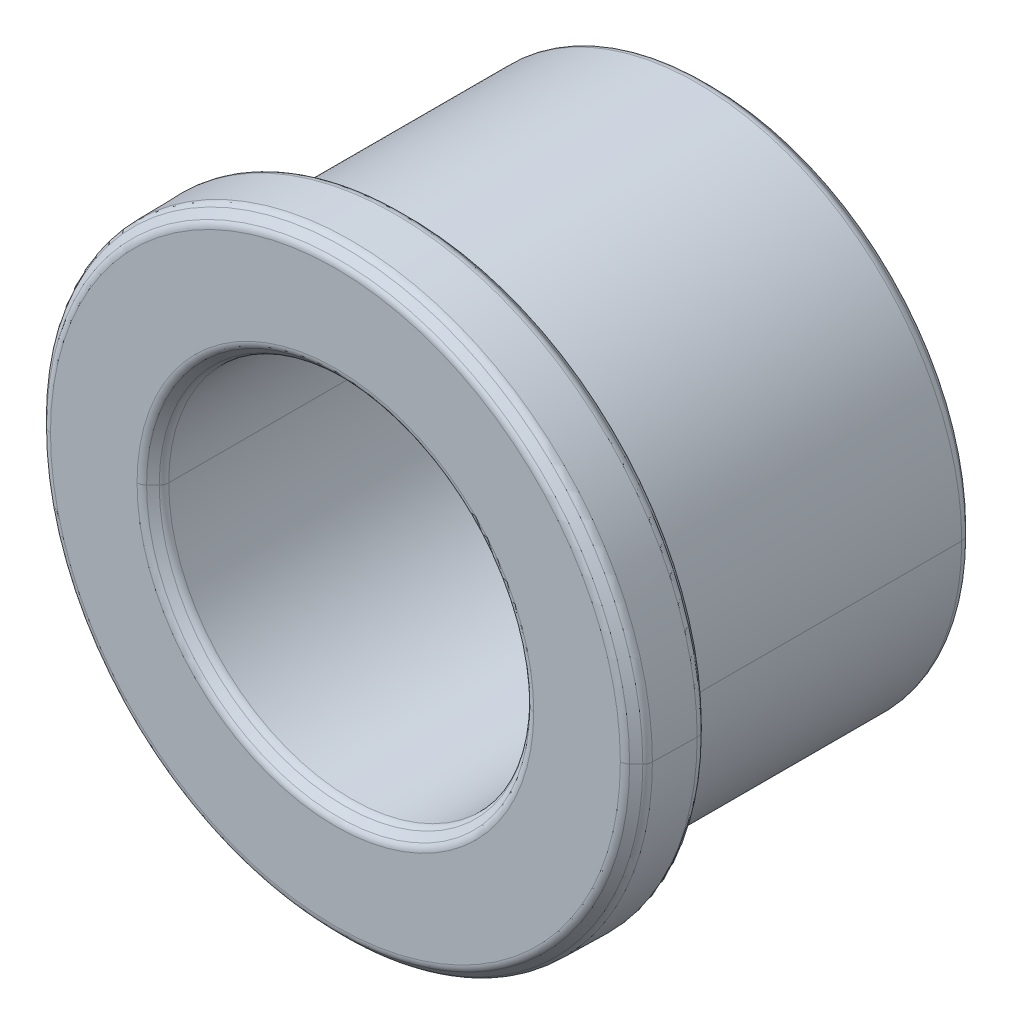
ISO-10303-21;
HEADER;
FILE_DESCRIPTION(('STEP AP214'),'2;1');
FILE_NAME('part.step','',(''),(''),'','','');
FILE_SCHEMA(('AUTOMOTIVE_DESIGN { 1 0 10303 214 1 1 1 1 }'));
ENDSEC;
DATA;
#1=APPLICATION_CONTEXT('core data for automotive mechanical design processes');
#2=APPLICATION_PROTOCOL_DEFINITION('international standard','automotive_design',2000,#1);
#3=PRODUCT_CONTEXT('',#1,'mechanical');
#4=PRODUCT('Part','Part','',(#3));
#5=PRODUCT_RELATED_PRODUCT_CATEGORY('part','',(#4));
#6=PRODUCT_DEFINITION_FORMATION('','',#4);
#7=PRODUCT_DEFINITION_CONTEXT('part definition',#1,'design');
#8=PRODUCT_DEFINITION('design','',#6,#7);
#9=PRODUCT_DEFINITION_SHAPE('','',#8);
#10=(LENGTH_UNIT() NAMED_UNIT(*) SI_UNIT(.MILLI.,.METRE.));
#11=(NAMED_UNIT(*) PLANE_ANGLE_UNIT() SI_UNIT($,.RADIAN.));
#12=(NAMED_UNIT(*) SI_UNIT($,.STERADIAN.) SOLID_ANGLE_UNIT());
#13=UNCERTAINTY_MEASURE_WITH_UNIT(LENGTH_MEASURE(1.E-05),#10,'distance_accuracy_value','');
#14=(GEOMETRIC_REPRESENTATION_CONTEXT(3) GLOBAL_UNCERTAINTY_ASSIGNED_CONTEXT((#13)) GLOBAL_UNIT_ASSIGNED_CONTEXT((#10,
#11,#12)) REPRESENTATION_CONTEXT('',''));
#15=CARTESIAN_POINT('',(0.,0.,0.));
#16=DIRECTION('',(0.,0.,1.));
#17=DIRECTION('',(1.,0.,0.));
#18=AXIS2_PLACEMENT_3D('',#15,#16,#17);
#19=CARTESIAN_POINT('',(0.,0.,3.76875));
#20=DIRECTION('',(0.,0.,-1.));
#21=DIRECTION('',(-1.,0.,0.));
#22=AXIS2_PLACEMENT_3D('',#19,#20,#21);
#23=TOROIDAL_SURFACE('',#22,5.98700479149173,0.2);
#24=CARTESIAN_POINT('',(5.98700479149173,0.,3.76875));
#25=DIRECTION('',(0.,1.,0.));
#26=DIRECTION('',(-1.,0.,0.));
#27=AXIS2_PLACEMENT_3D('',#24,#25,#26);
#28=CIRCLE('',#27,0.2);
#29=CARTESIAN_POINT('',(5.98700479149173,0.,3.96875));
#30=VERTEX_POINT('',#29);
#31=CARTESIAN_POINT('',(6.12593646558353,0.,3.91261796006773));
#32=VERTEX_POINT('',#31);
#33=EDGE_CURVE('E472',#30,#32,#28,.T.);
#34=ORIENTED_EDGE('',*,*,#33,.F.);
#35=CARTESIAN_POINT('',(0.,0.,3.96875));
#36=DIRECTION('',(0.,0.,1.));
#37=DIRECTION('',(-1.,0.,0.));
#38=AXIS2_PLACEMENT_3D('',#35,#36,#37);
#39=CIRCLE('',#38,5.98700479149173);
#40=CARTESIAN_POINT('',(-5.98700479149173,0.,3.96875));
#41=VERTEX_POINT('',#40);
#42=EDGE_CURVE('E334',#41,#30,#39,.T.);
#43=ORIENTED_EDGE('',*,*,#42,.F.);
#44=CARTESIAN_POINT('',(-5.98700479149173,0.,3.76875));
#45=DIRECTION('',(0.,-1.,0.));
#46=DIRECTION('',(0.,0.,-1.));
#47=AXIS2_PLACEMENT_3D('',#44,#45,#46);
#48=CIRCLE('',#47,0.2);
#49=CARTESIAN_POINT('',(-6.12593646558353,0.,3.91261796006773));
#50=VERTEX_POINT('',#49);
#51=EDGE_CURVE('E266',#41,#50,#48,.T.);
#52=ORIENTED_EDGE('',*,*,#51,.T.);
#53=CARTESIAN_POINT('',(0.,0.,3.91261796006773));
#54=DIRECTION('',(0.,0.,-1.));
#55=DIRECTION('',(-1.,0.,0.));
#56=AXIS2_PLACEMENT_3D('',#53,#54,#55);
#57=CIRCLE('',#56,6.12593646558353);
#58=EDGE_CURVE('E358',#32,#50,#57,.T.);
#59=ORIENTED_EDGE('',*,*,#58,.F.);
#60=EDGE_LOOP('',(#34,#43,#52,#59));
#61=FACE_BOUND('',#60,.T.);
#62=ADVANCED_FACE('F16',(#61),#23,.T.);
#63=CARTESIAN_POINT('',(0.,0.,3.76875));
#64=DIRECTION('',(0.,0.,-1.));
#65=DIRECTION('',(-1.,0.,0.));
#66=AXIS2_PLACEMENT_3D('',#63,#64,#65);
#67=TOROIDAL_SURFACE('',#66,4.16784271247462,0.2);
#68=CARTESIAN_POINT('',(4.16784271247462,0.,3.76875));
#69=DIRECTION('',(0.,1.,0.));
#70=DIRECTION('',(-1.,0.,0.));
#71=AXIS2_PLACEMENT_3D('',#68,#69,#70);
#72=CIRCLE('',#71,0.2);
#73=CARTESIAN_POINT('',(4.02642135623731,0.,3.91017135623731));
#74=VERTEX_POINT('',#73);
#75=CARTESIAN_POINT('',(4.16784271247462,0.,3.96875));
#76=VERTEX_POINT('',#75);
#77=EDGE_CURVE('E264',#74,#76,#72,.T.);
#78=ORIENTED_EDGE('',*,*,#77,.F.);
#79=CARTESIAN_POINT('',(0.,0.,3.91017135623731));
#80=DIRECTION('',(0.,0.,1.));
#81=DIRECTION('',(1.,0.,0.));
#82=AXIS2_PLACEMENT_3D('',#79,#80,#81);
#83=CIRCLE('',#82,4.02642135623731);
#84=CARTESIAN_POINT('',(-4.02642135623731,0.,3.91017135623731));
#85=VERTEX_POINT('',#84);
#86=EDGE_CURVE('E311',#85,#74,#83,.T.);
#87=ORIENTED_EDGE('',*,*,#86,.F.);
#88=CARTESIAN_POINT('',(-4.16784271247462,0.,3.76875));
#89=DIRECTION('',(0.,-1.,0.));
#90=DIRECTION('',(0.,0.,-1.));
#91=AXIS2_PLACEMENT_3D('',#88,#89,#90);
#92=CIRCLE('',#91,0.2);
#93=CARTESIAN_POINT('',(-4.16784271247462,0.,3.96875));
#94=VERTEX_POINT('',#93);
#95=EDGE_CURVE('E345',#85,#94,#92,.T.);
#96=ORIENTED_EDGE('',*,*,#95,.T.);
#97=CARTESIAN_POINT('',(0.,0.,3.96875));
#98=DIRECTION('',(0.,0.,-1.));
#99=DIRECTION('',(-1.,0.,0.));
#100=AXIS2_PLACEMENT_3D('',#97,#98,#99);
#101=CIRCLE('',#100,4.16784271247462);
#102=EDGE_CURVE('E300',#76,#94,#101,.T.);
#103=ORIENTED_EDGE('',*,*,#102,.F.);
#104=EDGE_LOOP('',(#78,#87,#96,#103));
#105=FACE_BOUND('',#104,.T.);
#106=ADVANCED_FACE('F18',(#105),#67,.T.);
#107=CARTESIAN_POINT('',(0.,0.,3.63590728752538));
#108=DIRECTION('',(0.,0.,-1.));
#109=DIRECTION('',(-1.,0.,0.));
#110=AXIS2_PLACEMENT_3D('',#107,#108,#109);
#111=TOROIDAL_SURFACE('',#110,4.035,0.2);
#112=CARTESIAN_POINT('',(4.035,0.,3.63590728752538));
#113=DIRECTION('',(0.,1.,0.));
#114=DIRECTION('',(-1.,0.,0.));
#115=AXIS2_PLACEMENT_3D('',#112,#113,#114);
#116=CIRCLE('',#115,0.2);
#117=CARTESIAN_POINT('',(3.835,0.,3.63590728752538));
#118=VERTEX_POINT('',#117);
#119=CARTESIAN_POINT('',(3.89357864376269,0.,3.77732864376269));
#120=VERTEX_POINT('',#119);
#121=EDGE_CURVE('E379',#118,#120,#116,.T.);
#122=ORIENTED_EDGE('',*,*,#121,.F.);
#123=CARTESIAN_POINT('',(0.,0.,3.63590728752538));
#124=DIRECTION('',(0.,0.,1.));
#125=DIRECTION('',(-1.,0.,0.));
#126=AXIS2_PLACEMENT_3D('',#123,#124,#125);
#127=CIRCLE('',#126,3.835);
#128=CARTESIAN_POINT('',(-3.835,0.,3.63590728752538));
#129=VERTEX_POINT('',#128);
#130=EDGE_CURVE('E331',#129,#118,#127,.T.);
#131=ORIENTED_EDGE('',*,*,#130,.F.);
#132=CARTESIAN_POINT('',(-4.035,0.,3.63590728752538));
#133=DIRECTION('',(0.,-1.,0.));
#134=DIRECTION('',(0.,0.,-1.));
#135=AXIS2_PLACEMENT_3D('',#132,#133,#134);
#136=CIRCLE('',#135,0.2);
#137=CARTESIAN_POINT('',(-3.89357864376269,0.,3.77732864376269));
#138=VERTEX_POINT('',#137);
#139=EDGE_CURVE('E258',#129,#138,#136,.T.);
#140=ORIENTED_EDGE('',*,*,#139,.T.);
#141=CARTESIAN_POINT('',(0.,0.,3.77732864376269));
#142=DIRECTION('',(0.,0.,-1.));
#143=DIRECTION('',(1.,0.,0.));
#144=AXIS2_PLACEMENT_3D('',#141,#142,#143);
#145=CIRCLE('',#144,3.89357864376269);
#146=EDGE_CURVE('E314',#120,#138,#145,.T.);
#147=ORIENTED_EDGE('',*,*,#146,.F.);
#148=EDGE_LOOP('',(#122,#131,#140,#147));
#149=FACE_BOUND('',#148,.T.);
#150=ADVANCED_FACE('F830',(#149),#111,.T.);
#151=CARTESIAN_POINT('',(0.,0.,-3.63590728752538));
#152=DIRECTION('',(0.,0.,1.));
#153=DIRECTION('',(1.,0.,0.));
#154=AXIS2_PLACEMENT_3D('',#151,#152,#153);
#155=TOROIDAL_SURFACE('',#154,4.035,0.2);
#156=CARTESIAN_POINT('',(-4.035,0.,-3.63590728752538));
#157=DIRECTION('',(0.,1.,0.));
#158=DIRECTION('',(-1.,0.,0.));
#159=AXIS2_PLACEMENT_3D('',#156,#157,#158);
#160=CIRCLE('',#159,0.2);
#161=CARTESIAN_POINT('',(-3.835,0.,-3.63590728752538));
#162=VERTEX_POINT('',#161);
#163=CARTESIAN_POINT('',(-3.89357864376269,0.,-3.77732864376269));
#164=VERTEX_POINT('',#163);
#165=EDGE_CURVE('E234',#162,#164,#160,.T.);
#166=ORIENTED_EDGE('',*,*,#165,.F.);
#167=CARTESIAN_POINT('',(0.,0.,-3.63590728752538));
#168=DIRECTION('',(0.,0.,-1.));
#169=DIRECTION('',(1.,0.,0.));
#170=AXIS2_PLACEMENT_3D('',#167,#168,#169);
#171=CIRCLE('',#170,3.835);
#172=CARTESIAN_POINT('',(3.835,0.,-3.63590728752538));
#173=VERTEX_POINT('',#172);
#174=EDGE_CURVE('E470',#173,#162,#171,.T.);
#175=ORIENTED_EDGE('',*,*,#174,.F.);
#176=CARTESIAN_POINT('',(4.035,0.,-3.63590728752538));
#177=DIRECTION('',(0.,-1.,0.));
#178=DIRECTION('',(0.,0.,-1.));
#179=AXIS2_PLACEMENT_3D('',#176,#177,#178);
#180=CIRCLE('',#179,0.2);
#181=CARTESIAN_POINT('',(3.89357864376269,0.,-3.77732864376269));
#182=VERTEX_POINT('',#181);
#183=EDGE_CURVE('E231',#173,#182,#180,.T.);
#184=ORIENTED_EDGE('',*,*,#183,.T.);
#185=CARTESIAN_POINT('',(0.,0.,-3.77732864376269));
#186=DIRECTION('',(0.,0.,1.));
#187=DIRECTION('',(-1.,0.,0.));
#188=AXIS2_PLACEMENT_3D('',#185,#186,#187);
#189=CIRCLE('',#188,3.89357864376269);
#190=EDGE_CURVE('E220',#164,#182,#189,.T.);
#191=ORIENTED_EDGE('',*,*,#190,.F.);
#192=EDGE_LOOP('',(#166,#175,#184,#191));
#193=FACE_BOUND('',#192,.T.);
#194=ADVANCED_FACE('F228',(#193),#155,.T.);
#195=CARTESIAN_POINT('',(0.,0.,3.6324674997952));
#196=DIRECTION('',(0.,0.,1.));
#197=DIRECTION('',(1.,0.,0.));
#198=AXIS2_PLACEMENT_3D('',#195,#196,#197);
#199=TOROIDAL_SURFACE('',#198,6.12812945169297,0.2);
#200=CARTESIAN_POINT('',(-6.12812945169297,0.,3.6324674997952));
#201=DIRECTION('',(0.,1.,0.));
#202=DIRECTION('',(-1.,0.,0.));
#203=AXIS2_PLACEMENT_3D('',#200,#201,#202);
#204=CIRCLE('',#203,0.2);
#205=CARTESIAN_POINT('',(-6.32809899072425,0.,3.63595798108265));
#206=VERTEX_POINT('',#205);
#207=CARTESIAN_POINT('',(-6.26706112578477,0.,3.77633545986293));
#208=VERTEX_POINT('',#207);
#209=EDGE_CURVE('E275',#206,#208,#204,.T.);
#210=ORIENTED_EDGE('',*,*,#209,.F.);
#211=CARTESIAN_POINT('',(0.,0.,3.63595798108265));
#212=DIRECTION('',(0.,0.,-1.));
#213=DIRECTION('',(-1.,0.,0.));
#214=AXIS2_PLACEMENT_3D('',#211,#212,#213);
#215=CIRCLE('',#214,6.32809899072425);
#216=CARTESIAN_POINT('',(6.32809899072425,0.,3.63595798108265));
#217=VERTEX_POINT('',#216);
#218=EDGE_CURVE('E302',#217,#206,#215,.T.);
#219=ORIENTED_EDGE('',*,*,#218,.F.);
#220=CARTESIAN_POINT('',(6.12812945169297,0.,3.6324674997952));
#221=DIRECTION('',(0.,-1.,0.));
#222=DIRECTION('',(0.,0.,-1.));
#223=AXIS2_PLACEMENT_3D('',#220,#221,#222);
#224=CIRCLE('',#223,0.2);
#225=CARTESIAN_POINT('',(6.26706112578477,0.,3.77633545986293));
#226=VERTEX_POINT('',#225);
#227=EDGE_CURVE('E271',#217,#226,#224,.T.);
#228=ORIENTED_EDGE('',*,*,#227,.T.);
#229=CARTESIAN_POINT('',(0.,0.,3.77633545986293));
#230=DIRECTION('',(0.,0.,1.));
#231=DIRECTION('',(-1.,0.,0.));
#232=AXIS2_PLACEMENT_3D('',#229,#230,#231);
#233=CIRCLE('',#232,6.26706112578477);
#234=EDGE_CURVE('E329',#208,#226,#233,.T.);
#235=ORIENTED_EDGE('',*,*,#234,.F.);
#236=EDGE_LOOP('',(#210,#219,#228,#235));
#237=FACE_BOUND('',#236,.T.);
#238=ADVANCED_FACE('F856',(#237),#199,.T.);
#239=CARTESIAN_POINT('',(0.,0.,2.70835264889125));
#240=DIRECTION('',(0.,0.,-1.));
#241=DIRECTION('',(-1.,0.,0.));
#242=AXIS2_PLACEMENT_3D('',#239,#240,#241);
#243=TOROIDAL_SURFACE('',#242,6.14425993641663,0.2);
#244=CARTESIAN_POINT('',(6.14425993641663,0.,2.70835264889125));
#245=DIRECTION('',(0.,1.,0.));
#246=DIRECTION('',(-1.,0.,0.));
#247=AXIS2_PLACEMENT_3D('',#244,#245,#246);
#248=CIRCLE('',#247,0.2);
#249=CARTESIAN_POINT('',(6.34422947544791,0.,2.71184313017871));
#250=VERTEX_POINT('',#249);
#251=CARTESIAN_POINT('',(6.28568129265394,0.,2.56693129265394));
#252=VERTEX_POINT('',#251);
#253=EDGE_CURVE('E388',#250,#252,#248,.T.);
#254=ORIENTED_EDGE('',*,*,#253,.F.);
#255=CARTESIAN_POINT('',(0.,0.,2.71184313017871));
#256=DIRECTION('',(0.,0.,1.));
#257=DIRECTION('',(-1.,0.,0.));
#258=AXIS2_PLACEMENT_3D('',#255,#256,#257);
#259=CIRCLE('',#258,6.34422947544791);
#260=CARTESIAN_POINT('',(-6.34422947544791,0.,2.71184313017871));
#261=VERTEX_POINT('',#260);
#262=EDGE_CURVE('E360',#261,#250,#259,.T.);
#263=ORIENTED_EDGE('',*,*,#262,.F.);
#264=CARTESIAN_POINT('',(-6.14425993641663,0.,2.70835264889125));
#265=DIRECTION('',(0.,-1.,0.));
#266=DIRECTION('',(0.,0.,-1.));
#267=AXIS2_PLACEMENT_3D('',#264,#265,#266);
#268=CIRCLE('',#267,0.2);
#269=CARTESIAN_POINT('',(-6.28568129265394,0.,2.56693129265394));
#270=VERTEX_POINT('',#269);
#271=EDGE_CURVE('E365',#261,#270,#268,.T.);
#272=ORIENTED_EDGE('',*,*,#271,.T.);
#273=CARTESIAN_POINT('',(0.,0.,2.56693129265394));
#274=DIRECTION('',(0.,0.,-1.));
#275=DIRECTION('',(1.,0.,0.));
#276=AXIS2_PLACEMENT_3D('',#273,#274,#275);
#277=CIRCLE('',#276,6.28568129265394);
#278=EDGE_CURVE('E20',#252,#270,#277,.T.);
#279=ORIENTED_EDGE('',*,*,#278,.F.);
#280=EDGE_LOOP('',(#254,#263,#272,#279));
#281=FACE_BOUND('',#280,.T.);
#282=ADVANCED_FACE('F424',(#281),#243,.T.);
#283=CARTESIAN_POINT('',(0.,0.,2.58125));
#284=DIRECTION('',(0.,0.,1.));
#285=DIRECTION('',(1.,0.,0.));
#286=AXIS2_PLACEMENT_3D('',#283,#284,#285);
#287=TOROIDAL_SURFACE('',#286,6.01715728752538,0.2);
#288=CARTESIAN_POINT('',(-6.01715728752538,0.,2.58125));
#289=DIRECTION('',(0.,1.,0.));
#290=DIRECTION('',(-1.,0.,0.));
#291=AXIS2_PLACEMENT_3D('',#288,#289,#290);
#292=CIRCLE('',#291,0.2);
#293=CARTESIAN_POINT('',(-6.01715728752538,0.,2.38125));
#294=VERTEX_POINT('',#293);
#295=CARTESIAN_POINT('',(-6.15857864376269,0.,2.43982864376269));
#296=VERTEX_POINT('',#295);
#297=EDGE_CURVE('E497',#294,#296,#292,.T.);
#298=ORIENTED_EDGE('',*,*,#297,.F.);
#299=CARTESIAN_POINT('',(0.,0.,2.38125));
#300=DIRECTION('',(0.,0.,-1.));
#301=DIRECTION('',(1.,0.,0.));
#302=AXIS2_PLACEMENT_3D('',#299,#300,#301);
#303=CIRCLE('',#302,6.01715728752538);
#304=CARTESIAN_POINT('',(6.01715728752538,0.,2.38125));
#305=VERTEX_POINT('',#304);
#306=EDGE_CURVE('E393',#305,#294,#303,.T.);
#307=ORIENTED_EDGE('',*,*,#306,.F.);
#308=CARTESIAN_POINT('',(6.01715728752538,0.,2.58125));
#309=DIRECTION('',(0.,-1.,0.));
#310=DIRECTION('',(0.,0.,-1.));
#311=AXIS2_PLACEMENT_3D('',#308,#309,#310);
#312=CIRCLE('',#311,0.2);
#313=CARTESIAN_POINT('',(6.15857864376269,0.,2.43982864376269));
#314=VERTEX_POINT('',#313);
#315=EDGE_CURVE('E342',#305,#314,#312,.T.);
#316=ORIENTED_EDGE('',*,*,#315,.T.);
#317=CARTESIAN_POINT('',(0.,0.,2.43982864376269));
#318=DIRECTION('',(0.,0.,1.));
#319=DIRECTION('',(1.,0.,0.));
#320=AXIS2_PLACEMENT_3D('',#317,#318,#319);
#321=CIRCLE('',#320,6.15857864376269);
#322=EDGE_CURVE('E330',#296,#314,#321,.T.);
#323=ORIENTED_EDGE('',*,*,#322,.F.);
#324=EDGE_LOOP('',(#298,#307,#316,#323));
#325=FACE_BOUND('',#324,.T.);
#326=ADVANCED_FACE('F597',(#325),#287,.T.);
#327=CARTESIAN_POINT('',(0.,0.,2.18125));
#328=DIRECTION('',(0.,0.,1.));
#329=DIRECTION('',(1.,0.,0.));
#330=AXIS2_PLACEMENT_3D('',#327,#328,#329);
#331=TOROIDAL_SURFACE('',#330,5.75625,0.2);
#332=CARTESIAN_POINT('',(-5.75625,0.,2.18125));
#333=DIRECTION('',(0.,1.,0.));
#334=DIRECTION('',(-1.,0.,0.));
#335=AXIS2_PLACEMENT_3D('',#332,#333,#334);
#336=CIRCLE('',#335,0.2);
#337=CARTESIAN_POINT('',(-5.75625,0.,2.38125));
#338=VERTEX_POINT('',#337);
#339=CARTESIAN_POINT('',(-5.55625,0.,2.18125));
#340=VERTEX_POINT('',#339);
#341=EDGE_CURVE('E290',#338,#340,#336,.T.);
#342=ORIENTED_EDGE('',*,*,#341,.F.);
#343=CARTESIAN_POINT('',(0.,0.,2.38125));
#344=DIRECTION('',(0.,0.,1.));
#345=DIRECTION('',(1.,0.,0.));
#346=AXIS2_PLACEMENT_3D('',#343,#344,#345);
#347=CIRCLE('',#346,5.75625);
#348=CARTESIAN_POINT('',(5.75625,0.,2.38125));
#349=VERTEX_POINT('',#348);
#350=EDGE_CURVE('E361',#349,#338,#347,.T.);
#351=ORIENTED_EDGE('',*,*,#350,.F.);
#352=CARTESIAN_POINT('',(5.75625,0.,2.18125));
#353=DIRECTION('',(0.,-1.,0.));
#354=DIRECTION('',(0.,0.,-1.));
#355=AXIS2_PLACEMENT_3D('',#352,#353,#354);
#356=CIRCLE('',#355,0.2);
#357=CARTESIAN_POINT('',(5.55625,0.,2.18125));
#358=VERTEX_POINT('',#357);
#359=EDGE_CURVE('E305',#349,#358,#356,.T.);
#360=ORIENTED_EDGE('',*,*,#359,.T.);
#361=CARTESIAN_POINT('',(0.,0.,2.18125));
#362=DIRECTION('',(0.,0.,-1.));
#363=DIRECTION('',(1.,0.,0.));
#364=AXIS2_PLACEMENT_3D('',#361,#362,#363);
#365=CIRCLE('',#364,5.55625);
#366=EDGE_CURVE('E485',#340,#358,#365,.T.);
#367=ORIENTED_EDGE('',*,*,#366,.F.);
#368=EDGE_LOOP('',(#342,#351,#360,#367));
#369=FACE_BOUND('',#368,.T.);
#370=ADVANCED_FACE('F585',(#369),#331,.F.);
#371=CARTESIAN_POINT('',(0.,0.,-3.63590728752538));
#372=DIRECTION('',(0.,0.,-1.));
#373=DIRECTION('',(-1.,0.,0.));
#374=AXIS2_PLACEMENT_3D('',#371,#372,#373);
#375=TOROIDAL_SURFACE('',#374,5.35625,0.2);
#376=CARTESIAN_POINT('',(5.35625,0.,-3.63590728752538));
#377=DIRECTION('',(0.,1.,0.));
#378=DIRECTION('',(-1.,0.,0.));
#379=AXIS2_PLACEMENT_3D('',#376,#377,#378);
#380=CIRCLE('',#379,0.2);
#381=CARTESIAN_POINT('',(5.55625,0.,-3.63590728752538));
#382=VERTEX_POINT('',#381);
#383=CARTESIAN_POINT('',(5.49767135623731,0.,-3.77732864376269));
#384=VERTEX_POINT('',#383);
#385=EDGE_CURVE('E284',#382,#384,#380,.T.);
#386=ORIENTED_EDGE('',*,*,#385,.F.);
#387=CARTESIAN_POINT('',(0.,0.,-3.63590728752538));
#388=DIRECTION('',(0.,0.,1.));
#389=DIRECTION('',(-1.,0.,0.));
#390=AXIS2_PLACEMENT_3D('',#387,#388,#389);
#391=CIRCLE('',#390,5.55625);
#392=CARTESIAN_POINT('',(-5.55625,0.,-3.63590728752538));
#393=VERTEX_POINT('',#392);
#394=EDGE_CURVE('E355',#393,#382,#391,.T.);
#395=ORIENTED_EDGE('',*,*,#394,.F.);
#396=CARTESIAN_POINT('',(-5.35625,0.,-3.63590728752538));
#397=DIRECTION('',(0.,-1.,0.));
#398=DIRECTION('',(0.,0.,-1.));
#399=AXIS2_PLACEMENT_3D('',#396,#397,#398);
#400=CIRCLE('',#399,0.2);
#401=CARTESIAN_POINT('',(-5.49767135623731,0.,-3.77732864376269));
#402=VERTEX_POINT('',#401);
#403=EDGE_CURVE('E453',#393,#402,#400,.T.);
#404=ORIENTED_EDGE('',*,*,#403,.T.);
#405=CARTESIAN_POINT('',(0.,0.,-3.77732864376269));
#406=DIRECTION('',(0.,0.,-1.));
#407=DIRECTION('',(1.,0.,0.));
#408=AXIS2_PLACEMENT_3D('',#405,#406,#407);
#409=CIRCLE('',#408,5.49767135623731);
#410=EDGE_CURVE('E10',#384,#402,#409,.T.);
#411=ORIENTED_EDGE('',*,*,#410,.F.);
#412=EDGE_LOOP('',(#386,#395,#404,#411));
#413=FACE_BOUND('',#412,.T.);
#414=ADVANCED_FACE('F542',(#413),#375,.T.);
#415=CARTESIAN_POINT('',(0.,0.,-3.76875));
#416=DIRECTION('',(0.,0.,1.));
#417=DIRECTION('',(1.,0.,0.));
#418=AXIS2_PLACEMENT_3D('',#415,#416,#417);
#419=TOROIDAL_SURFACE('',#418,5.22340728752538,0.2);
#420=CARTESIAN_POINT('',(-5.22340728752538,0.,-3.76875));
#421=DIRECTION('',(0.,1.,0.));
#422=DIRECTION('',(-1.,0.,0.));
#423=AXIS2_PLACEMENT_3D('',#420,#421,#422);
#424=CIRCLE('',#423,0.2);
#425=CARTESIAN_POINT('',(-5.22340728752538,0.,-3.96875));
#426=VERTEX_POINT('',#425);
#427=CARTESIAN_POINT('',(-5.36482864376269,0.,-3.91017135623731));
#428=VERTEX_POINT('',#427);
#429=EDGE_CURVE('E387',#426,#428,#424,.T.);
#430=ORIENTED_EDGE('',*,*,#429,.F.);
#431=CARTESIAN_POINT('',(0.,0.,-3.96875));
#432=DIRECTION('',(0.,0.,-1.));
#433=DIRECTION('',(1.,0.,0.));
#434=AXIS2_PLACEMENT_3D('',#431,#432,#433);
#435=CIRCLE('',#434,5.22340728752538);
#436=CARTESIAN_POINT('',(5.22340728752538,0.,-3.96875));
#437=VERTEX_POINT('',#436);
#438=EDGE_CURVE('E186',#437,#426,#435,.T.);
#439=ORIENTED_EDGE('',*,*,#438,.F.);
#440=CARTESIAN_POINT('',(5.22340728752538,0.,-3.76875));
#441=DIRECTION('',(0.,-1.,0.));
#442=DIRECTION('',(0.,0.,-1.));
#443=AXIS2_PLACEMENT_3D('',#440,#441,#442);
#444=CIRCLE('',#443,0.2);
#445=CARTESIAN_POINT('',(5.36482864376269,0.,-3.91017135623731));
#446=VERTEX_POINT('',#445);
#447=EDGE_CURVE('E384',#437,#446,#444,.T.);
#448=ORIENTED_EDGE('',*,*,#447,.T.);
#449=CARTESIAN_POINT('',(0.,0.,-3.91017135623731));
#450=DIRECTION('',(0.,0.,1.));
#451=DIRECTION('',(1.,0.,0.));
#452=AXIS2_PLACEMENT_3D('',#449,#450,#451);
#453=CIRCLE('',#452,5.36482864376269);
#454=EDGE_CURVE('E30',#428,#446,#453,.T.);
#455=ORIENTED_EDGE('',*,*,#454,.F.);
#456=EDGE_LOOP('',(#430,#439,#448,#455));
#457=FACE_BOUND('',#456,.T.);
#458=ADVANCED_FACE('F535',(#457),#419,.T.);
#459=CARTESIAN_POINT('',(0.,0.,-3.76875));
#460=DIRECTION('',(0.,0.,1.));
#461=DIRECTION('',(1.,0.,0.));
#462=AXIS2_PLACEMENT_3D('',#459,#460,#461);
#463=TOROIDAL_SURFACE('',#462,4.16784271247462,0.2);
#464=CARTESIAN_POINT('',(-4.16784271247462,0.,-3.76875));
#465=DIRECTION('',(0.,1.,0.));
#466=DIRECTION('',(-1.,0.,0.));
#467=AXIS2_PLACEMENT_3D('',#464,#465,#466);
#468=CIRCLE('',#467,0.2);
#469=CARTESIAN_POINT('',(-4.02642135623731,0.,-3.91017135623731));
#470=VERTEX_POINT('',#469);
#471=CARTESIAN_POINT('',(-4.16784271247462,0.,-3.96875));
#472=VERTEX_POINT('',#471);
#473=EDGE_CURVE('E500',#470,#472,#468,.T.);
#474=ORIENTED_EDGE('',*,*,#473,.F.);
#475=CARTESIAN_POINT('',(0.,0.,-3.91017135623731));
#476=DIRECTION('',(0.,0.,-1.));
#477=DIRECTION('',(-1.,0.,0.));
#478=AXIS2_PLACEMENT_3D('',#475,#476,#477);
#479=CIRCLE('',#478,4.02642135623731);
#480=CARTESIAN_POINT('',(4.02642135623731,0.,-3.91017135623731));
#481=VERTEX_POINT('',#480);
#482=EDGE_CURVE('E218',#481,#470,#479,.T.);
#483=ORIENTED_EDGE('',*,*,#482,.F.);
#484=CARTESIAN_POINT('',(4.16784271247462,0.,-3.76875));
#485=DIRECTION('',(0.,-1.,0.));
#486=DIRECTION('',(0.,0.,-1.));
#487=AXIS2_PLACEMENT_3D('',#484,#485,#486);
#488=CIRCLE('',#487,0.2);
#489=CARTESIAN_POINT('',(4.16784271247462,0.,-3.96875));
#490=VERTEX_POINT('',#489);
#491=EDGE_CURVE('E373',#481,#490,#488,.T.);
#492=ORIENTED_EDGE('',*,*,#491,.T.);
#493=CARTESIAN_POINT('',(0.,0.,-3.96875));
#494=DIRECTION('',(0.,0.,1.));
#495=DIRECTION('',(1.,0.,0.));
#496=AXIS2_PLACEMENT_3D('',#493,#494,#495);
#497=CIRCLE('',#496,4.16784271247462);
#498=EDGE_CURVE('E41',#472,#490,#497,.T.);
#499=ORIENTED_EDGE('',*,*,#498,.F.);
#500=EDGE_LOOP('',(#474,#483,#492,#499));
#501=FACE_BOUND('',#500,.T.);
#502=ADVANCED_FACE('F952',(#501),#463,.T.);
#503=CARTESIAN_POINT('',(0.,0.,3.71875));
#504=DIRECTION('',(0.,0.,1.));
#505=DIRECTION('',(1.,0.,0.));
#506=AXIS2_PLACEMENT_3D('',#503,#504,#505);
#507=CONICAL_SURFACE('',#506,3.835,0.785398163397452);
#508=DIRECTION('',(-0.70710678118655,0.,0.707106781186545));
#509=VECTOR('',#508,1.);
#510=CARTESIAN_POINT('',(-3.835,0.,3.71875));
#511=LINE('',#510,#509);
#512=EDGE_CURVE('E310',#138,#85,#511,.T.);
#513=ORIENTED_EDGE('',*,*,#512,.F.);
#514=CARTESIAN_POINT('',(0.,0.,3.77732864376269));
#515=DIRECTION('',(0.,0.,-1.));
#516=DIRECTION('',(1.,0.,0.));
#517=AXIS2_PLACEMENT_3D('',#514,#515,#516);
#518=CIRCLE('',#517,3.89357864376269);
#519=EDGE_CURVE('E458',#138,#120,#518,.T.);
#520=ORIENTED_EDGE('',*,*,#519,.T.);
#521=DIRECTION('',(0.70710678118655,0.,0.707106781186545));
#522=VECTOR('',#521,1.);
#523=CARTESIAN_POINT('',(3.835,0.,3.71875));
#524=LINE('',#523,#522);
#525=EDGE_CURVE('E237',#120,#74,#524,.T.);
#526=ORIENTED_EDGE('',*,*,#525,.T.);
#527=CARTESIAN_POINT('',(0.,0.,3.91017135623731));
#528=DIRECTION('',(0.,0.,1.));
#529=DIRECTION('',(1.,0.,0.));
#530=AXIS2_PLACEMENT_3D('',#527,#528,#529);
#531=CIRCLE('',#530,4.02642135623731);
#532=EDGE_CURVE('E265',#74,#85,#531,.T.);
#533=ORIENTED_EDGE('',*,*,#532,.T.);
#534=EDGE_LOOP('',(#513,#520,#526,#533));
#535=FACE_BOUND('',#534,.T.);
#536=ADVANCED_FACE('F613',(#535),#507,.F.);
#537=CARTESIAN_POINT('',(0.,0.,-3.96875));
#538=DIRECTION('',(0.,0.,-1.));
#539=DIRECTION('',(-1.,0.,0.));
#540=AXIS2_PLACEMENT_3D('',#537,#538,#539);
#541=CONICAL_SURFACE('',#540,4.085,0.785398163397448);
#542=DIRECTION('',(0.707106781186548,0.,-0.707106781186548));
#543=VECTOR('',#542,1.);
#544=CARTESIAN_POINT('',(4.085,0.,-3.96875));
#545=LINE('',#544,#543);
#546=EDGE_CURVE('E238',#182,#481,#545,.T.);
#547=ORIENTED_EDGE('',*,*,#546,.F.);
#548=CARTESIAN_POINT('',(0.,0.,-3.77732864376269));
#549=DIRECTION('',(0.,0.,1.));
#550=DIRECTION('',(-1.,0.,0.));
#551=AXIS2_PLACEMENT_3D('',#548,#549,#550);
#552=CIRCLE('',#551,3.89357864376269);
#553=EDGE_CURVE('E241',#182,#164,#552,.T.);
#554=ORIENTED_EDGE('',*,*,#553,.T.);
#555=DIRECTION('',(-0.707106781186548,0.,-0.707106781186548));
#556=VECTOR('',#555,1.);
#557=CARTESIAN_POINT('',(-4.085,0.,-3.96875));
#558=LINE('',#557,#556);
#559=EDGE_CURVE('E213',#164,#470,#558,.T.);
#560=ORIENTED_EDGE('',*,*,#559,.T.);
#561=CARTESIAN_POINT('',(0.,0.,-3.91017135623731));
#562=DIRECTION('',(0.,0.,-1.));
#563=DIRECTION('',(-1.,0.,0.));
#564=AXIS2_PLACEMENT_3D('',#561,#562,#563);
#565=CIRCLE('',#564,4.02642135623731);
#566=EDGE_CURVE('E257',#470,#481,#565,.T.);
#567=ORIENTED_EDGE('',*,*,#566,.T.);
#568=EDGE_LOOP('',(#547,#554,#560,#567));
#569=FACE_BOUND('',#568,.T.);
#570=ADVANCED_FACE('F245',(#569),#541,.F.);
#571=CARTESIAN_POINT('',(0.,0.,-3.71875));
#572=DIRECTION('',(0.,0.,1.));
#573=DIRECTION('',(1.,0.,0.));
#574=AXIS2_PLACEMENT_3D('',#571,#572,#573);
#575=CONICAL_SURFACE('',#574,5.55625,0.785398163397452);
#576=DIRECTION('',(-0.70710678118655,0.,0.707106781186545));
#577=VECTOR('',#576,1.);
#578=CARTESIAN_POINT('',(-5.55625,0.,-3.71875));
#579=LINE('',#578,#577);
#580=EDGE_CURVE('E223',#428,#402,#579,.T.);
#581=ORIENTED_EDGE('',*,*,#580,.F.);
#582=ORIENTED_EDGE('',*,*,#454,.T.);
#583=DIRECTION('',(0.70710678118655,0.,0.707106781186545));
#584=VECTOR('',#583,1.);
#585=CARTESIAN_POINT('',(5.55625,0.,-3.71875));
#586=LINE('',#585,#584);
#587=EDGE_CURVE('E317',#446,#384,#586,.T.);
#588=ORIENTED_EDGE('',*,*,#587,.T.);
#589=ORIENTED_EDGE('',*,*,#410,.T.);
#590=EDGE_LOOP('',(#581,#582,#588,#589));
#591=FACE_BOUND('',#590,.T.);
#592=ADVANCED_FACE('F531',(#591),#575,.T.);
#593=CARTESIAN_POINT('',(0.,0.,2.62696109685089));
#594=DIRECTION('',(0.,0.,1.));
#595=DIRECTION('',(1.,0.,0.));
#596=AXIS2_PLACEMENT_3D('',#593,#594,#595);
#597=CONICAL_SURFACE('',#596,6.34571109685088,0.785398163397453);
#598=DIRECTION('',(-0.707106781186552,0.,0.707106781186544));
#599=VECTOR('',#598,1.);
#600=CARTESIAN_POINT('',(-6.34571109685088,0.,2.62696109685089));
#601=LINE('',#600,#599);
#602=EDGE_CURVE('E312',#296,#270,#601,.T.);
#603=ORIENTED_EDGE('',*,*,#602,.F.);
#604=ORIENTED_EDGE('',*,*,#322,.T.);
#605=DIRECTION('',(0.707106781186552,0.,0.707106781186544));
#606=VECTOR('',#605,1.);
#607=CARTESIAN_POINT('',(6.34571109685088,0.,2.62696109685089));
#608=LINE('',#607,#606);
#609=EDGE_CURVE('E279',#314,#252,#608,.T.);
#610=ORIENTED_EDGE('',*,*,#609,.T.);
#611=ORIENTED_EDGE('',*,*,#278,.T.);
#612=EDGE_LOOP('',(#603,#604,#610,#611));
#613=FACE_BOUND('',#612,.T.);
#614=ADVANCED_FACE('F409',(#613),#597,.T.);
#615=CARTESIAN_POINT('',(0.,0.,3.96875));
#616=DIRECTION('',(0.,0.,-1.));
#617=DIRECTION('',(-1.,0.,0.));
#618=AXIS2_PLACEMENT_3D('',#615,#616,#617);
#619=CONICAL_SURFACE('',#618,6.06781003665876,0.802851455917392);
#620=DIRECTION('',(0.719339800338652,0.,-0.694658370458997));
#621=VECTOR('',#620,1.);
#622=CARTESIAN_POINT('',(6.06781003665876,0.,3.96875));
#623=LINE('',#622,#621);
#624=EDGE_CURVE('E272',#32,#226,#623,.T.);
#625=ORIENTED_EDGE('',*,*,#624,.F.);
#626=ORIENTED_EDGE('',*,*,#58,.T.);
#627=DIRECTION('',(-0.719339800338652,0.,-0.694658370458997));
#628=VECTOR('',#627,1.);
#629=CARTESIAN_POINT('',(-6.06781003665876,0.,3.96875));
#630=LINE('',#629,#628);
#631=EDGE_CURVE('E280',#50,#208,#630,.T.);
#632=ORIENTED_EDGE('',*,*,#631,.T.);
#633=ORIENTED_EDGE('',*,*,#234,.T.);
#634=EDGE_LOOP('',(#625,#626,#632,#633));
#635=FACE_BOUND('',#634,.T.);
#636=ADVANCED_FACE('F882',(#635),#619,.T.);
#637=CARTESIAN_POINT('',(0.,0.,2.38125));
#638=DIRECTION('',(0.,0.,-1.));
#639=DIRECTION('',(1.,0.,0.));
#640=AXIS2_PLACEMENT_3D('',#637,#638,#639);
#641=CONICAL_SURFACE('',#640,6.35,0.0174532925199415);
#642=DIRECTION('',(-0.0174524064372835,0.,-0.999847695156391));
#643=VECTOR('',#642,1.);
#644=CARTESIAN_POINT('',(-6.35,0.,2.38125));
#645=LINE('',#644,#643);
#646=EDGE_CURVE('E352',#206,#261,#645,.T.);
#647=ORIENTED_EDGE('',*,*,#646,.F.);
#648=CARTESIAN_POINT('',(0.,0.,3.63595798108265));
#649=DIRECTION('',(0.,0.,-1.));
#650=DIRECTION('',(-1.,0.,0.));
#651=AXIS2_PLACEMENT_3D('',#648,#649,#650);
#652=CIRCLE('',#651,6.32809899072425);
#653=EDGE_CURVE('E276',#206,#217,#652,.T.);
#654=ORIENTED_EDGE('',*,*,#653,.T.);
#655=DIRECTION('',(0.0174524064372835,0.,-0.999847695156391));
#656=VECTOR('',#655,1.);
#657=CARTESIAN_POINT('',(6.35,0.,2.38125));
#658=LINE('',#657,#656);
#659=EDGE_CURVE('E483',#217,#250,#658,.T.);
#660=ORIENTED_EDGE('',*,*,#659,.T.);
#661=CARTESIAN_POINT('',(0.,0.,2.71184313017871));
#662=DIRECTION('',(0.,0.,1.));
#663=DIRECTION('',(-1.,0.,0.));
#664=AXIS2_PLACEMENT_3D('',#661,#662,#663);
#665=CIRCLE('',#664,6.34422947544791);
#666=EDGE_CURVE('E323',#250,#261,#665,.T.);
#667=ORIENTED_EDGE('',*,*,#666,.T.);
#668=EDGE_LOOP('',(#647,#654,#660,#667));
#669=FACE_BOUND('',#668,.T.);
#670=ADVANCED_FACE('F595',(#669),#641,.T.);
#671=CARTESIAN_POINT('',(-5.55625,0.,2.38125));
#672=DIRECTION('',(0.,0.,1.));
#673=DIRECTION('',(1.,0.,0.));
#674=AXIS2_PLACEMENT_3D('',#671,#672,#673);
#675=PLANE('',#674);
#676=ORIENTED_EDGE('',*,*,#350,.T.);
#677=CARTESIAN_POINT('',(0.,0.,2.38125));
#678=DIRECTION('',(0.,0.,1.));
#679=DIRECTION('',(1.,0.,0.));
#680=AXIS2_PLACEMENT_3D('',#677,#678,#679);
#681=CIRCLE('',#680,5.75625);
#682=EDGE_CURVE('E292',#338,#349,#681,.T.);
#683=ORIENTED_EDGE('',*,*,#682,.T.);
#684=EDGE_LOOP('',(#676,#683));
#685=FACE_BOUND('',#684,.T.);
#686=ORIENTED_EDGE('',*,*,#306,.T.);
#687=CARTESIAN_POINT('',(0.,0.,2.38125));
#688=DIRECTION('',(0.,0.,-1.));
#689=DIRECTION('',(1.,0.,0.));
#690=AXIS2_PLACEMENT_3D('',#687,#688,#689);
#691=CIRCLE('',#690,6.01715728752538);
#692=EDGE_CURVE('E366',#294,#305,#691,.T.);
#693=ORIENTED_EDGE('',*,*,#692,.T.);
#694=EDGE_LOOP('',(#686,#693));
#695=FACE_BOUND('',#694,.T.);
#696=ADVANCED_FACE('F589',(#685,#695),#675,.F.);
#697=CARTESIAN_POINT('',(0.,0.,10.5788114163766));
#698=DIRECTION('',(0.,0.,1.));
#699=DIRECTION('',(1.,0.,0.));
#700=AXIS2_PLACEMENT_3D('',#697,#698,#699);
#701=CYLINDRICAL_SURFACE('',#700,5.55625);
#702=DIRECTION('',(0.,0.,1.));
#703=VECTOR('',#702,1.);
#704=CARTESIAN_POINT('',(-5.55625,0.,10.5788114163766));
#705=LINE('',#704,#703);
#706=EDGE_CURVE('E476',#393,#340,#705,.T.);
#707=ORIENTED_EDGE('',*,*,#706,.F.);
#708=ORIENTED_EDGE('',*,*,#394,.T.);
#709=DIRECTION('',(0.,0.,1.));
#710=VECTOR('',#709,1.);
#711=CARTESIAN_POINT('',(5.55625,0.,10.5788114163766));
#712=LINE('',#711,#710);
#713=EDGE_CURVE('E505',#382,#358,#712,.T.);
#714=ORIENTED_EDGE('',*,*,#713,.T.);
#715=CARTESIAN_POINT('',(0.,0.,2.18125));
#716=DIRECTION('',(0.,0.,-1.));
#717=DIRECTION('',(1.,0.,0.));
#718=AXIS2_PLACEMENT_3D('',#715,#716,#717);
#719=CIRCLE('',#718,5.55625);
#720=EDGE_CURVE('E293',#358,#340,#719,.T.);
#721=ORIENTED_EDGE('',*,*,#720,.T.);
#722=EDGE_LOOP('',(#707,#708,#714,#721));
#723=FACE_BOUND('',#722,.T.);
#724=ADVANCED_FACE('F576',(#723),#701,.T.);
#725=CARTESIAN_POINT('',(-3.835,0.,-3.96875));
#726=DIRECTION('',(0.,0.,1.));
#727=DIRECTION('',(1.,0.,0.));
#728=AXIS2_PLACEMENT_3D('',#725,#726,#727);
#729=PLANE('',#728);
#730=CARTESIAN_POINT('',(0.,0.,-3.96875));
#731=DIRECTION('',(0.,0.,1.));
#732=DIRECTION('',(1.,0.,0.));
#733=AXIS2_PLACEMENT_3D('',#730,#731,#732);
#734=CIRCLE('',#733,4.16784271247462);
#735=EDGE_CURVE('E501',#490,#472,#734,.T.);
#736=ORIENTED_EDGE('',*,*,#735,.T.);
#737=ORIENTED_EDGE('',*,*,#498,.T.);
#738=EDGE_LOOP('',(#736,#737));
#739=FACE_BOUND('',#738,.T.);
#740=ORIENTED_EDGE('',*,*,#438,.T.);
#741=CARTESIAN_POINT('',(0.,0.,-3.96875));
#742=DIRECTION('',(0.,0.,-1.));
#743=DIRECTION('',(1.,0.,0.));
#744=AXIS2_PLACEMENT_3D('',#741,#742,#743);
#745=CIRCLE('',#744,5.22340728752538);
#746=EDGE_CURVE('E443',#426,#437,#745,.T.);
#747=ORIENTED_EDGE('',*,*,#746,.T.);
#748=EDGE_LOOP('',(#740,#747));
#749=FACE_BOUND('',#748,.T.);
#750=ADVANCED_FACE('F526',(#739,#749),#729,.F.);
#751=CARTESIAN_POINT('',(0.,0.,10.5788114163766));
#752=DIRECTION('',(0.,0.,1.));
#753=DIRECTION('',(1.,0.,0.));
#754=AXIS2_PLACEMENT_3D('',#751,#752,#753);
#755=CYLINDRICAL_SURFACE('',#754,3.835);
#756=DIRECTION('',(0.,0.,1.));
#757=VECTOR('',#756,1.);
#758=CARTESIAN_POINT('',(-3.835,0.,10.5788114163766));
#759=LINE('',#758,#757);
#760=EDGE_CURVE('E339',#162,#129,#759,.T.);
#761=ORIENTED_EDGE('',*,*,#760,.F.);
#762=CARTESIAN_POINT('',(0.,0.,-3.63590728752538));
#763=DIRECTION('',(0.,0.,-1.));
#764=DIRECTION('',(1.,0.,0.));
#765=AXIS2_PLACEMENT_3D('',#762,#763,#764);
#766=CIRCLE('',#765,3.835);
#767=EDGE_CURVE('E249',#162,#173,#766,.T.);
#768=ORIENTED_EDGE('',*,*,#767,.T.);
#769=DIRECTION('',(0.,0.,1.));
#770=VECTOR('',#769,1.);
#771=CARTESIAN_POINT('',(3.835,0.,10.5788114163766));
#772=LINE('',#771,#770);
#773=EDGE_CURVE('E337',#173,#118,#772,.T.);
#774=ORIENTED_EDGE('',*,*,#773,.T.);
#775=CARTESIAN_POINT('',(0.,0.,3.63590728752538));
#776=DIRECTION('',(0.,0.,1.));
#777=DIRECTION('',(-1.,0.,0.));
#778=AXIS2_PLACEMENT_3D('',#775,#776,#777);
#779=CIRCLE('',#778,3.835);
#780=EDGE_CURVE('E348',#118,#129,#779,.T.);
#781=ORIENTED_EDGE('',*,*,#780,.T.);
#782=EDGE_LOOP('',(#761,#768,#774,#781));
#783=FACE_BOUND('',#782,.T.);
#784=ADVANCED_FACE('F632',(#783),#755,.F.);
#785=CARTESIAN_POINT('',(-6.35,0.,3.96875));
#786=DIRECTION('',(0.,0.,-1.));
#787=DIRECTION('',(0.,-1.,0.));
#788=AXIS2_PLACEMENT_3D('',#785,#786,#787);
#789=PLANE('',#788);
#790=CARTESIAN_POINT('',(0.,0.,3.96875));
#791=DIRECTION('',(0.,0.,-1.));
#792=DIRECTION('',(-1.,0.,0.));
#793=AXIS2_PLACEMENT_3D('',#790,#791,#792);
#794=CIRCLE('',#793,4.16784271247462);
#795=EDGE_CURVE('E347',#94,#76,#794,.T.);
#796=ORIENTED_EDGE('',*,*,#795,.T.);
#797=ORIENTED_EDGE('',*,*,#102,.T.);
#798=EDGE_LOOP('',(#796,#797));
#799=FACE_BOUND('',#798,.T.);
#800=ORIENTED_EDGE('',*,*,#42,.T.);
#801=CARTESIAN_POINT('',(0.,0.,3.96875));
#802=DIRECTION('',(0.,0.,1.));
#803=DIRECTION('',(-1.,0.,0.));
#804=AXIS2_PLACEMENT_3D('',#801,#802,#803);
#805=CIRCLE('',#804,5.98700479149173);
#806=EDGE_CURVE('E469',#30,#41,#805,.T.);
#807=ORIENTED_EDGE('',*,*,#806,.T.);
#808=EDGE_LOOP('',(#800,#807));
#809=FACE_BOUND('',#808,.T.);
#810=ADVANCED_FACE('F630',(#799,#809),#789,.F.);
#811=CARTESIAN_POINT('',(0.,0.,10.5788114163766));
#812=DIRECTION('',(0.,0.,1.));
#813=DIRECTION('',(1.,0.,0.));
#814=AXIS2_PLACEMENT_3D('',#811,#812,#813);
#815=CYLINDRICAL_SURFACE('',#814,3.835);
#816=ORIENTED_EDGE('',*,*,#174,.T.);
#817=ORIENTED_EDGE('',*,*,#760,.T.);
#818=ORIENTED_EDGE('',*,*,#130,.T.);
#819=ORIENTED_EDGE('',*,*,#773,.F.);
#820=EDGE_LOOP('',(#816,#817,#818,#819));
#821=FACE_BOUND('',#820,.T.);
#822=ADVANCED_FACE('F629',(#821),#815,.F.);
#823=CARTESIAN_POINT('',(0.,0.,10.5788114163766));
#824=DIRECTION('',(0.,0.,1.));
#825=DIRECTION('',(1.,0.,0.));
#826=AXIS2_PLACEMENT_3D('',#823,#824,#825);
#827=CYLINDRICAL_SURFACE('',#826,5.55625);
#828=CARTESIAN_POINT('',(0.,0.,-3.63590728752538));
#829=DIRECTION('',(0.,0.,1.));
#830=DIRECTION('',(-1.,0.,0.));
#831=AXIS2_PLACEMENT_3D('',#828,#829,#830);
#832=CIRCLE('',#831,5.55625);
#833=EDGE_CURVE('E287',#382,#393,#832,.T.);
#834=ORIENTED_EDGE('',*,*,#833,.T.);
#835=ORIENTED_EDGE('',*,*,#706,.T.);
#836=ORIENTED_EDGE('',*,*,#366,.T.);
#837=ORIENTED_EDGE('',*,*,#713,.F.);
#838=EDGE_LOOP('',(#834,#835,#836,#837));
#839=FACE_BOUND('',#838,.T.);
#840=ADVANCED_FACE('F547',(#839),#827,.T.);
#841=CARTESIAN_POINT('',(0.,0.,2.38125));
#842=DIRECTION('',(0.,0.,-1.));
#843=DIRECTION('',(1.,0.,0.));
#844=AXIS2_PLACEMENT_3D('',#841,#842,#843);
#845=CONICAL_SURFACE('',#844,6.35,0.0174532925199415);
#846=ORIENTED_EDGE('',*,*,#218,.T.);
#847=ORIENTED_EDGE('',*,*,#646,.T.);
#848=ORIENTED_EDGE('',*,*,#262,.T.);
#849=ORIENTED_EDGE('',*,*,#659,.F.);
#850=EDGE_LOOP('',(#846,#847,#848,#849));
#851=FACE_BOUND('',#850,.T.);
#852=ADVANCED_FACE('F835',(#851),#845,.T.);
#853=CARTESIAN_POINT('',(0.,0.,3.96875));
#854=DIRECTION('',(0.,0.,-1.));
#855=DIRECTION('',(-1.,0.,0.));
#856=AXIS2_PLACEMENT_3D('',#853,#854,#855);
#857=CONICAL_SURFACE('',#856,6.06781003665876,0.802851455917392);
#858=CARTESIAN_POINT('',(0.,0.,3.91261796006773));
#859=DIRECTION('',(0.,0.,-1.));
#860=DIRECTION('',(-1.,0.,0.));
#861=AXIS2_PLACEMENT_3D('',#858,#859,#860);
#862=CIRCLE('',#861,6.12593646558353);
#863=EDGE_CURVE('E482',#50,#32,#862,.T.);
#864=ORIENTED_EDGE('',*,*,#863,.T.);
#865=ORIENTED_EDGE('',*,*,#624,.T.);
#866=CARTESIAN_POINT('',(0.,0.,3.77633545986293));
#867=DIRECTION('',(0.,0.,1.));
#868=DIRECTION('',(-1.,0.,0.));
#869=AXIS2_PLACEMENT_3D('',#866,#867,#868);
#870=CIRCLE('',#869,6.26706112578477);
#871=EDGE_CURVE('E270',#226,#208,#870,.T.);
#872=ORIENTED_EDGE('',*,*,#871,.T.);
#873=ORIENTED_EDGE('',*,*,#631,.F.);
#874=EDGE_LOOP('',(#864,#865,#872,#873));
#875=FACE_BOUND('',#874,.T.);
#876=ADVANCED_FACE('F831',(#875),#857,.T.);
#877=CARTESIAN_POINT('',(0.,0.,2.62696109685089));
#878=DIRECTION('',(0.,0.,1.));
#879=DIRECTION('',(1.,0.,0.));
#880=AXIS2_PLACEMENT_3D('',#877,#878,#879);
#881=CONICAL_SURFACE('',#880,6.34571109685088,0.785398163397453);
#882=CARTESIAN_POINT('',(0.,0.,2.43982864376269));
#883=DIRECTION('',(0.,0.,1.));
#884=DIRECTION('',(1.,0.,0.));
#885=AXIS2_PLACEMENT_3D('',#882,#883,#884);
#886=CIRCLE('',#885,6.15857864376269);
#887=EDGE_CURVE('E423',#314,#296,#886,.T.);
#888=ORIENTED_EDGE('',*,*,#887,.T.);
#889=ORIENTED_EDGE('',*,*,#602,.T.);
#890=CARTESIAN_POINT('',(0.,0.,2.56693129265394));
#891=DIRECTION('',(0.,0.,-1.));
#892=DIRECTION('',(1.,0.,0.));
#893=AXIS2_PLACEMENT_3D('',#890,#891,#892);
#894=CIRCLE('',#893,6.28568129265394);
#895=EDGE_CURVE('E369',#270,#252,#894,.T.);
#896=ORIENTED_EDGE('',*,*,#895,.T.);
#897=ORIENTED_EDGE('',*,*,#609,.F.);
#898=EDGE_LOOP('',(#888,#889,#896,#897));
#899=FACE_BOUND('',#898,.T.);
#900=ADVANCED_FACE('F417',(#899),#881,.T.);
#901=CARTESIAN_POINT('',(0.,0.,-3.71875));
#902=DIRECTION('',(0.,0.,1.));
#903=DIRECTION('',(1.,0.,0.));
#904=AXIS2_PLACEMENT_3D('',#901,#902,#903);
#905=CONICAL_SURFACE('',#904,5.55625,0.785398163397452);
#906=CARTESIAN_POINT('',(0.,0.,-3.91017135623731));
#907=DIRECTION('',(0.,0.,1.));
#908=DIRECTION('',(1.,0.,0.));
#909=AXIS2_PLACEMENT_3D('',#906,#907,#908);
#910=CIRCLE('',#909,5.36482864376269);
#911=EDGE_CURVE('E381',#446,#428,#910,.T.);
#912=ORIENTED_EDGE('',*,*,#911,.T.);
#913=ORIENTED_EDGE('',*,*,#580,.T.);
#914=CARTESIAN_POINT('',(0.,0.,-3.77732864376269));
#915=DIRECTION('',(0.,0.,-1.));
#916=DIRECTION('',(1.,0.,0.));
#917=AXIS2_PLACEMENT_3D('',#914,#915,#916);
#918=CIRCLE('',#917,5.49767135623731);
#919=EDGE_CURVE('E289',#402,#384,#918,.T.);
#920=ORIENTED_EDGE('',*,*,#919,.T.);
#921=ORIENTED_EDGE('',*,*,#587,.F.);
#922=EDGE_LOOP('',(#912,#913,#920,#921));
#923=FACE_BOUND('',#922,.T.);
#924=ADVANCED_FACE('F532',(#923),#905,.T.);
#925=CARTESIAN_POINT('',(0.,0.,-3.96875));
#926=DIRECTION('',(0.,0.,-1.));
#927=DIRECTION('',(-1.,0.,0.));
#928=AXIS2_PLACEMENT_3D('',#925,#926,#927);
#929=CONICAL_SURFACE('',#928,4.085,0.785398163397448);
#930=ORIENTED_EDGE('',*,*,#190,.T.);
#931=ORIENTED_EDGE('',*,*,#546,.T.);
#932=ORIENTED_EDGE('',*,*,#482,.T.);
#933=ORIENTED_EDGE('',*,*,#559,.F.);
#934=EDGE_LOOP('',(#930,#931,#932,#933));
#935=FACE_BOUND('',#934,.T.);
#936=ADVANCED_FACE('F214',(#935),#929,.F.);
#937=CARTESIAN_POINT('',(0.,0.,3.71875));
#938=DIRECTION('',(0.,0.,1.));
#939=DIRECTION('',(1.,0.,0.));
#940=AXIS2_PLACEMENT_3D('',#937,#938,#939);
#941=CONICAL_SURFACE('',#940,3.835,0.785398163397452);
#942=ORIENTED_EDGE('',*,*,#146,.T.);
#943=ORIENTED_EDGE('',*,*,#512,.T.);
#944=ORIENTED_EDGE('',*,*,#86,.T.);
#945=ORIENTED_EDGE('',*,*,#525,.F.);
#946=EDGE_LOOP('',(#942,#943,#944,#945));
#947=FACE_BOUND('',#946,.T.);
#948=ADVANCED_FACE('F616',(#947),#941,.F.);
#949=CARTESIAN_POINT('',(0.,0.,-3.76875));
#950=DIRECTION('',(0.,0.,1.));
#951=DIRECTION('',(1.,0.,0.));
#952=AXIS2_PLACEMENT_3D('',#949,#950,#951);
#953=TOROIDAL_SURFACE('',#952,4.16784271247462,0.2);
#954=ORIENTED_EDGE('',*,*,#566,.F.);
#955=ORIENTED_EDGE('',*,*,#473,.T.);
#956=ORIENTED_EDGE('',*,*,#735,.F.);
#957=ORIENTED_EDGE('',*,*,#491,.F.);
#958=EDGE_LOOP('',(#954,#955,#956,#957));
#959=FACE_BOUND('',#958,.T.);
#960=ADVANCED_FACE('F849',(#959),#953,.T.);
#961=CARTESIAN_POINT('',(0.,0.,-3.76875));
#962=DIRECTION('',(0.,0.,1.));
#963=DIRECTION('',(1.,0.,0.));
#964=AXIS2_PLACEMENT_3D('',#961,#962,#963);
#965=TOROIDAL_SURFACE('',#964,5.22340728752538,0.2);
#966=ORIENTED_EDGE('',*,*,#746,.F.);
#967=ORIENTED_EDGE('',*,*,#429,.T.);
#968=ORIENTED_EDGE('',*,*,#911,.F.);
#969=ORIENTED_EDGE('',*,*,#447,.F.);
#970=EDGE_LOOP('',(#966,#967,#968,#969));
#971=FACE_BOUND('',#970,.T.);
#972=ADVANCED_FACE('F529',(#971),#965,.T.);
#973=CARTESIAN_POINT('',(0.,0.,-3.63590728752538));
#974=DIRECTION('',(0.,0.,-1.));
#975=DIRECTION('',(-1.,0.,0.));
#976=AXIS2_PLACEMENT_3D('',#973,#974,#975);
#977=TOROIDAL_SURFACE('',#976,5.35625,0.2);
#978=ORIENTED_EDGE('',*,*,#833,.F.);
#979=ORIENTED_EDGE('',*,*,#385,.T.);
#980=ORIENTED_EDGE('',*,*,#919,.F.);
#981=ORIENTED_EDGE('',*,*,#403,.F.);
#982=EDGE_LOOP('',(#978,#979,#980,#981));
#983=FACE_BOUND('',#982,.T.);
#984=ADVANCED_FACE('F541',(#983),#977,.T.);
#985=CARTESIAN_POINT('',(0.,0.,2.18125));
#986=DIRECTION('',(0.,0.,1.));
#987=DIRECTION('',(1.,0.,0.));
#988=AXIS2_PLACEMENT_3D('',#985,#986,#987);
#989=TOROIDAL_SURFACE('',#988,5.75625,0.2);
#990=ORIENTED_EDGE('',*,*,#682,.F.);
#991=ORIENTED_EDGE('',*,*,#341,.T.);
#992=ORIENTED_EDGE('',*,*,#720,.F.);
#993=ORIENTED_EDGE('',*,*,#359,.F.);
#994=EDGE_LOOP('',(#990,#991,#992,#993));
#995=FACE_BOUND('',#994,.T.);
#996=ADVANCED_FACE('F590',(#995),#989,.F.);
#997=CARTESIAN_POINT('',(0.,0.,2.58125));
#998=DIRECTION('',(0.,0.,1.));
#999=DIRECTION('',(1.,0.,0.));
#1000=AXIS2_PLACEMENT_3D('',#997,#998,#999);
#1001=TOROIDAL_SURFACE('',#1000,6.01715728752538,0.2);
#1002=ORIENTED_EDGE('',*,*,#692,.F.);
#1003=ORIENTED_EDGE('',*,*,#297,.T.);
#1004=ORIENTED_EDGE('',*,*,#887,.F.);
#1005=ORIENTED_EDGE('',*,*,#315,.F.);
#1006=EDGE_LOOP('',(#1002,#1003,#1004,#1005));
#1007=FACE_BOUND('',#1006,.T.);
#1008=ADVANCED_FACE('F601',(#1007),#1001,.T.);
#1009=CARTESIAN_POINT('',(0.,0.,2.70835264889125));
#1010=DIRECTION('',(0.,0.,-1.));
#1011=DIRECTION('',(-1.,0.,0.));
#1012=AXIS2_PLACEMENT_3D('',#1009,#1010,#1011);
#1013=TOROIDAL_SURFACE('',#1012,6.14425993641663,0.2);
#1014=ORIENTED_EDGE('',*,*,#666,.F.);
#1015=ORIENTED_EDGE('',*,*,#253,.T.);
#1016=ORIENTED_EDGE('',*,*,#895,.F.);
#1017=ORIENTED_EDGE('',*,*,#271,.F.);
#1018=EDGE_LOOP('',(#1014,#1015,#1016,#1017));
#1019=FACE_BOUND('',#1018,.T.);
#1020=ADVANCED_FACE('F428',(#1019),#1013,.T.);
#1021=CARTESIAN_POINT('',(0.,0.,3.6324674997952));
#1022=DIRECTION('',(0.,0.,1.));
#1023=DIRECTION('',(1.,0.,0.));
#1024=AXIS2_PLACEMENT_3D('',#1021,#1022,#1023);
#1025=TOROIDAL_SURFACE('',#1024,6.12812945169297,0.2);
#1026=ORIENTED_EDGE('',*,*,#653,.F.);
#1027=ORIENTED_EDGE('',*,*,#209,.T.);
#1028=ORIENTED_EDGE('',*,*,#871,.F.);
#1029=ORIENTED_EDGE('',*,*,#227,.F.);
#1030=EDGE_LOOP('',(#1026,#1027,#1028,#1029));
#1031=FACE_BOUND('',#1030,.T.);
#1032=ADVANCED_FACE('F897',(#1031),#1025,.T.);
#1033=CARTESIAN_POINT('',(0.,0.,-3.63590728752538));
#1034=DIRECTION('',(0.,0.,1.));
#1035=DIRECTION('',(1.,0.,0.));
#1036=AXIS2_PLACEMENT_3D('',#1033,#1034,#1035);
#1037=TOROIDAL_SURFACE('',#1036,4.035,0.2);
#1038=ORIENTED_EDGE('',*,*,#767,.F.);
#1039=ORIENTED_EDGE('',*,*,#165,.T.);
#1040=ORIENTED_EDGE('',*,*,#553,.F.);
#1041=ORIENTED_EDGE('',*,*,#183,.F.);
#1042=EDGE_LOOP('',(#1038,#1039,#1040,#1041));
#1043=FACE_BOUND('',#1042,.T.);
#1044=ADVANCED_FACE('F247',(#1043),#1037,.T.);
#1045=CARTESIAN_POINT('',(0.,0.,3.63590728752538));
#1046=DIRECTION('',(0.,0.,-1.));
#1047=DIRECTION('',(-1.,0.,0.));
#1048=AXIS2_PLACEMENT_3D('',#1045,#1046,#1047);
#1049=TOROIDAL_SURFACE('',#1048,4.035,0.2);
#1050=ORIENTED_EDGE('',*,*,#780,.F.);
#1051=ORIENTED_EDGE('',*,*,#121,.T.);
#1052=ORIENTED_EDGE('',*,*,#519,.F.);
#1053=ORIENTED_EDGE('',*,*,#139,.F.);
#1054=EDGE_LOOP('',(#1050,#1051,#1052,#1053));
#1055=FACE_BOUND('',#1054,.T.);
#1056=ADVANCED_FACE('F898',(#1055),#1049,.T.);
#1057=CARTESIAN_POINT('',(0.,0.,3.76875));
#1058=DIRECTION('',(0.,0.,-1.));
#1059=DIRECTION('',(-1.,0.,0.));
#1060=AXIS2_PLACEMENT_3D('',#1057,#1058,#1059);
#1061=TOROIDAL_SURFACE('',#1060,4.16784271247462,0.2);
#1062=ORIENTED_EDGE('',*,*,#532,.F.);
#1063=ORIENTED_EDGE('',*,*,#77,.T.);
#1064=ORIENTED_EDGE('',*,*,#795,.F.);
#1065=ORIENTED_EDGE('',*,*,#95,.F.);
#1066=EDGE_LOOP('',(#1062,#1063,#1064,#1065));
#1067=FACE_BOUND('',#1066,.T.);
#1068=ADVANCED_FACE('F624',(#1067),#1061,.T.);
#1069=CARTESIAN_POINT('',(0.,0.,3.76875));
#1070=DIRECTION('',(0.,0.,-1.));
#1071=DIRECTION('',(-1.,0.,0.));
#1072=AXIS2_PLACEMENT_3D('',#1069,#1070,#1071);
#1073=TOROIDAL_SURFACE('',#1072,5.98700479149173,0.2);
#1074=ORIENTED_EDGE('',*,*,#806,.F.);
#1075=ORIENTED_EDGE('',*,*,#33,.T.);
#1076=ORIENTED_EDGE('',*,*,#863,.F.);
#1077=ORIENTED_EDGE('',*,*,#51,.F.);
#1078=EDGE_LOOP('',(#1074,#1075,#1076,#1077));
#1079=FACE_BOUND('',#1078,.T.);
#1080=ADVANCED_FACE('F643',(#1079),#1073,.T.);
#1081=CLOSED_SHELL('',(#62,#106,#150,#194,#238,#282,#326,#370,#414,#458,#502,#536,#570,#592,
#614,#636,#670,#696,#724,#750,#784,#810,#822,#840,#852,#876,#900,#924,#936,#948,#960,#972,#984,
#996,#1008,#1020,#1032,#1044,#1056,#1068,#1080));
#1082=MANIFOLD_SOLID_BREP('B1',#1081);
#1083=ADVANCED_BREP_SHAPE_REPRESENTATION('',(#18,#1082),#14);
#1084=SHAPE_DEFINITION_REPRESENTATION(#9,#1083);
ENDSEC;
END-ISO-10303-21;
